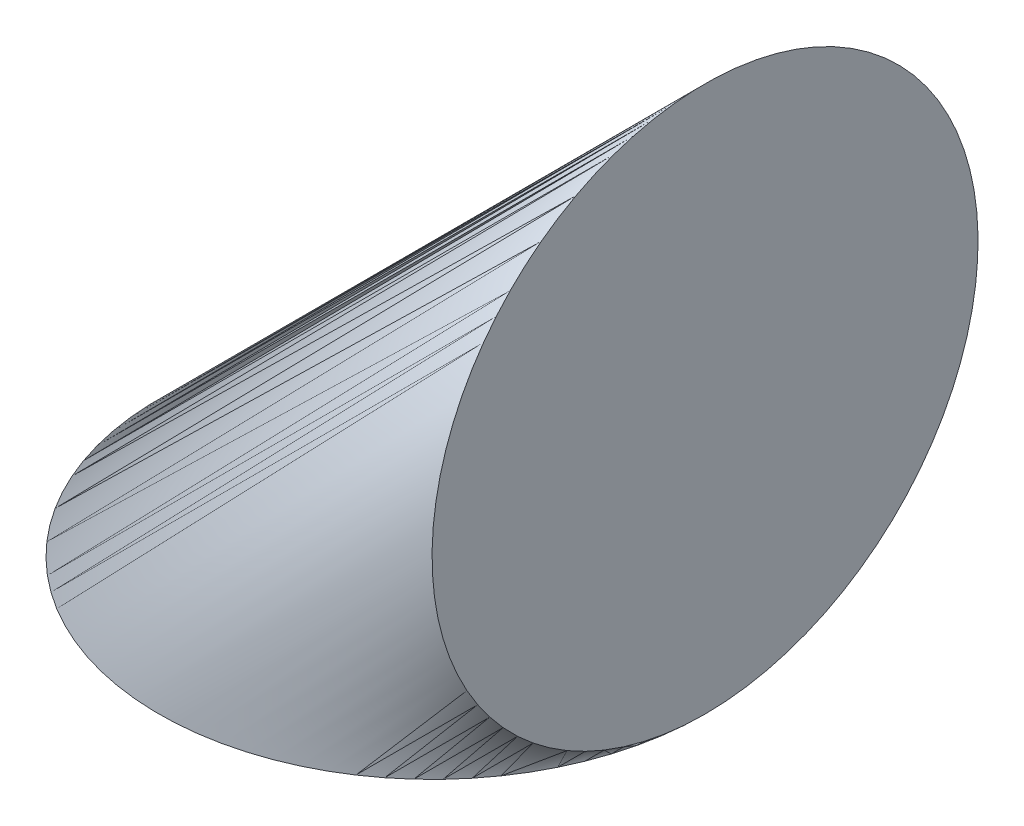
ISO-10303-21;
HEADER;
FILE_DESCRIPTION(('STEP AP214'),'2;1');
FILE_NAME('part.step','',(''),(''),'','','');
FILE_SCHEMA(('AUTOMOTIVE_DESIGN { 1 0 10303 214 1 1 1 1 }'));
ENDSEC;
DATA;
#1=APPLICATION_CONTEXT('core data for automotive mechanical design processes');
#2=APPLICATION_PROTOCOL_DEFINITION('international standard','automotive_design',2000,#1);
#3=PRODUCT_CONTEXT('',#1,'mechanical');
#4=PRODUCT('Part','Part','',(#3));
#5=PRODUCT_RELATED_PRODUCT_CATEGORY('part','',(#4));
#6=PRODUCT_DEFINITION_FORMATION('','',#4);
#7=PRODUCT_DEFINITION_CONTEXT('part definition',#1,'design');
#8=PRODUCT_DEFINITION('design','',#6,#7);
#9=PRODUCT_DEFINITION_SHAPE('','',#8);
#10=(LENGTH_UNIT() NAMED_UNIT(*) SI_UNIT(.MILLI.,.METRE.));
#11=(NAMED_UNIT(*) PLANE_ANGLE_UNIT() SI_UNIT($,.RADIAN.));
#12=(NAMED_UNIT(*) SI_UNIT($,.STERADIAN.) SOLID_ANGLE_UNIT());
#13=UNCERTAINTY_MEASURE_WITH_UNIT(LENGTH_MEASURE(1.E-05),#10,'distance_accuracy_value','');
#14=(GEOMETRIC_REPRESENTATION_CONTEXT(3) GLOBAL_UNCERTAINTY_ASSIGNED_CONTEXT((#13)) GLOBAL_UNIT_ASSIGNED_CONTEXT((#10,
#11,#12)) REPRESENTATION_CONTEXT('',''));
#15=CARTESIAN_POINT('',(0.,0.,0.));
#16=DIRECTION('',(0.,0.,1.));
#17=DIRECTION('',(1.,0.,0.));
#18=AXIS2_PLACEMENT_3D('',#15,#16,#17);
#19=CARTESIAN_POINT('',(0.,0.,0.));
#20=DIRECTION('',(0.,1.,0.));
#21=DIRECTION('',(0.,0.,1.));
#22=AXIS2_PLACEMENT_3D('',#19,#20,#21);
#23=PLANE('',#22);
#24=CARTESIAN_POINT('',(0.,0.,0.));
#25=DIRECTION('',(0.,1.,0.));
#26=DIRECTION('',(0.,0.,1.));
#27=AXIS2_PLACEMENT_3D('',#24,#25,#26);
#28=CIRCLE('',#27,50.);
#29=CARTESIAN_POINT('',(50.,0.,0.));
#30=VERTEX_POINT('',#29);
#31=EDGE_CURVE('E56',#30,#30,#28,.T.);
#32=ORIENTED_EDGE('',*,*,#31,.F.);
#33=EDGE_LOOP('',(#32));
#34=FACE_BOUND('',#33,.T.);
#35=ADVANCED_FACE('F50',(#34),#23,.F.);
#36=CARTESIAN_POINT('',(50.,50.,0.));
#37=DIRECTION('',(1.,0.,0.));
#38=DIRECTION('',(0.,0.,1.));
#39=AXIS2_PLACEMENT_3D('',#36,#37,#38);
#40=PLANE('',#39);
#41=CARTESIAN_POINT('',(50.,50.,0.));
#42=DIRECTION('',(1.,0.,0.));
#43=DIRECTION('',(0.,0.,1.));
#44=AXIS2_PLACEMENT_3D('',#41,#42,#43);
#45=CIRCLE('',#44,50.);
#46=EDGE_CURVE('E11',#30,#30,#45,.T.);
#47=ORIENTED_EDGE('',*,*,#46,.T.);
#48=EDGE_LOOP('',(#47));
#49=FACE_BOUND('',#48,.T.);
#50=ADVANCED_FACE('F63',(#49),#40,.T.);
#51=CARTESIAN_POINT('',(50.,0.,0.));
#52=DIRECTION('',(0.,0.,-1.));
#53=DIRECTION('',(-1.,0.,0.));
#54=AXIS2_PLACEMENT_3D('',#51,#52,#53);
#55=DEGENERATE_TOROIDAL_SURFACE('',#54,50.,50.,.T.);
#56=ORIENTED_EDGE('',*,*,#46,.F.);
#57=ORIENTED_EDGE('',*,*,#31,.T.);
#58=EDGE_LOOP('',(#56,#57));
#59=FACE_BOUND('',#58,.T.);
#60=ADVANCED_FACE('F64',(#59),#55,.T.);
#61=CLOSED_SHELL('',(#35,#50,#60));
#62=MANIFOLD_SOLID_BREP('B2',#61);
#63=ADVANCED_BREP_SHAPE_REPRESENTATION('',(#18,#62),#14);
#64=SHAPE_DEFINITION_REPRESENTATION(#9,#63);
ENDSEC;
END-ISO-10303-21;
